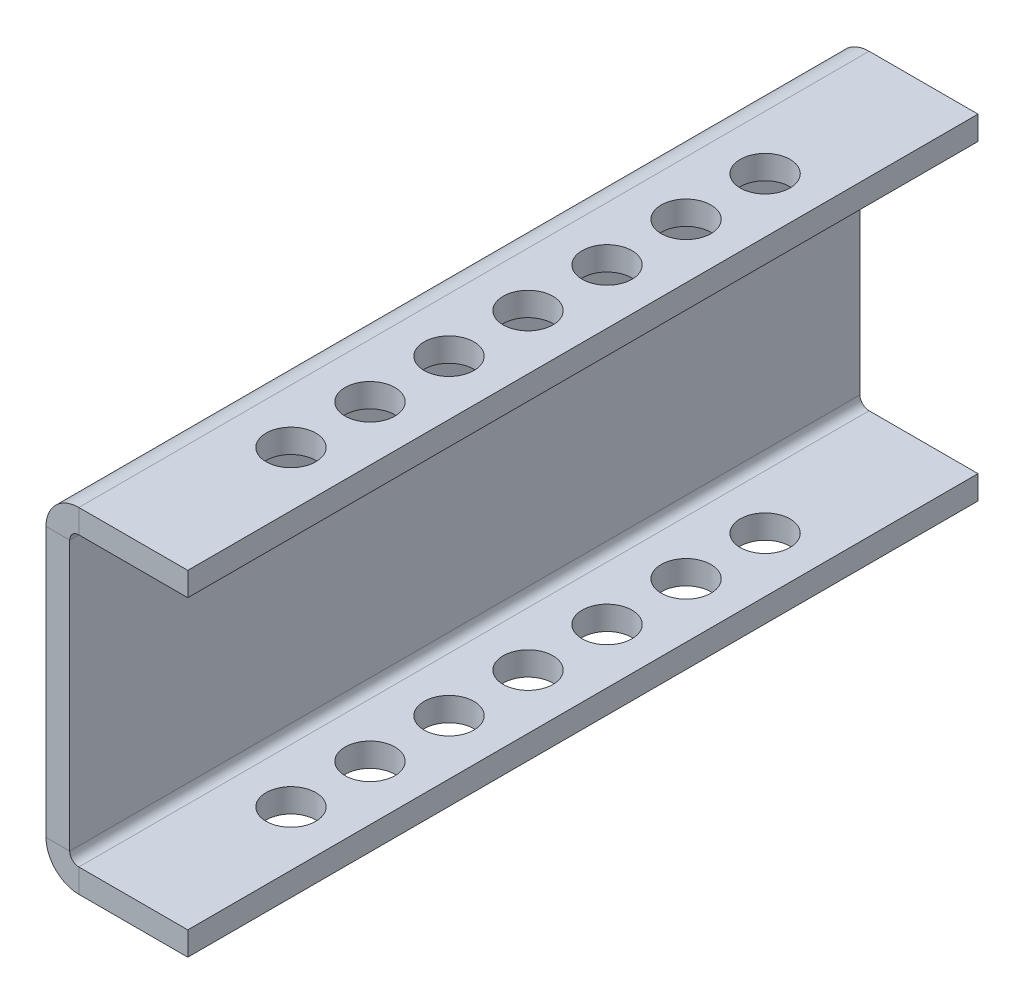
ISO-10303-21;
HEADER;
FILE_DESCRIPTION(('STEP AP214'),'2;1');
FILE_NAME('part.step','',(''),(''),'','','');
FILE_SCHEMA(('AUTOMOTIVE_DESIGN { 1 0 10303 214 1 1 1 1 }'));
ENDSEC;
DATA;
#1=APPLICATION_CONTEXT('core data for automotive mechanical design processes');
#2=APPLICATION_PROTOCOL_DEFINITION('international standard','automotive_design',2000,#1);
#3=PRODUCT_CONTEXT('',#1,'mechanical');
#4=PRODUCT('Part','Part','',(#3));
#5=PRODUCT_RELATED_PRODUCT_CATEGORY('part','',(#4));
#6=PRODUCT_DEFINITION_FORMATION('','',#4);
#7=PRODUCT_DEFINITION_CONTEXT('part definition',#1,'design');
#8=PRODUCT_DEFINITION('design','',#6,#7);
#9=PRODUCT_DEFINITION_SHAPE('','',#8);
#10=(LENGTH_UNIT() NAMED_UNIT(*) SI_UNIT(.MILLI.,.METRE.));
#11=(NAMED_UNIT(*) PLANE_ANGLE_UNIT() SI_UNIT($,.RADIAN.));
#12=(NAMED_UNIT(*) SI_UNIT($,.STERADIAN.) SOLID_ANGLE_UNIT());
#13=UNCERTAINTY_MEASURE_WITH_UNIT(LENGTH_MEASURE(1.E-05),#10,'distance_accuracy_value','');
#14=(GEOMETRIC_REPRESENTATION_CONTEXT(3) GLOBAL_UNCERTAINTY_ASSIGNED_CONTEXT((#13)) GLOBAL_UNIT_ASSIGNED_CONTEXT((#10,
#11,#12)) REPRESENTATION_CONTEXT('',''));
#15=CARTESIAN_POINT('',(0.,0.,0.));
#16=DIRECTION('',(0.,0.,1.));
#17=DIRECTION('',(1.,0.,0.));
#18=AXIS2_PLACEMENT_3D('',#15,#16,#17);
#19=CARTESIAN_POINT('',(-1.905,0.,0.));
#20=DIRECTION('',(-1.,0.,0.));
#21=DIRECTION('',(0.,0.,1.));
#22=AXIS2_PLACEMENT_3D('',#19,#20,#21);
#23=PLANE('',#22);
#24=DIRECTION('',(0.,-1.,0.));
#25=VECTOR('',#24,1.);
#26=CARTESIAN_POINT('',(-1.905,22.225,31.75));
#27=LINE('',#26,#25);
#28=CARTESIAN_POINT('',(-1.905,10.8204,31.75));
#29=VERTEX_POINT('',#28);
#30=CARTESIAN_POINT('',(-1.905,-10.8204,31.75));
#31=VERTEX_POINT('',#30);
#32=EDGE_CURVE('E248',#29,#31,#27,.T.);
#33=ORIENTED_EDGE('',*,*,#32,.F.);
#34=DIRECTION('',(0.,0.,-1.));
#35=VECTOR('',#34,1.);
#36=CARTESIAN_POINT('',(-1.905,10.8204,0.));
#37=LINE('',#36,#35);
#38=CARTESIAN_POINT('',(-1.905,10.8204,-31.75));
#39=VERTEX_POINT('',#38);
#40=EDGE_CURVE('E239',#29,#39,#37,.T.);
#41=ORIENTED_EDGE('',*,*,#40,.T.);
#42=DIRECTION('',(0.,1.,0.));
#43=VECTOR('',#42,1.);
#44=CARTESIAN_POINT('',(-1.905,22.225,-31.75));
#45=LINE('',#44,#43);
#46=CARTESIAN_POINT('',(-1.905,-10.8204,-31.75));
#47=VERTEX_POINT('',#46);
#48=EDGE_CURVE('E231',#47,#39,#45,.T.);
#49=ORIENTED_EDGE('',*,*,#48,.F.);
#50=DIRECTION('',(0.,0.,-1.));
#51=VECTOR('',#50,1.);
#52=CARTESIAN_POINT('',(-1.905,-10.8204,0.));
#53=LINE('',#52,#51);
#54=EDGE_CURVE('E227',#31,#47,#53,.T.);
#55=ORIENTED_EDGE('',*,*,#54,.F.);
#56=EDGE_LOOP('',(#33,#41,#49,#55));
#57=FACE_BOUND('',#56,.T.);
#58=ADVANCED_FACE('F47',(#57),#23,.T.);
#59=CARTESIAN_POINT('',(-1.905,22.225,-31.75));
#60=DIRECTION('',(0.,0.,-1.));
#61=DIRECTION('',(-1.,0.,0.));
#62=AXIS2_PLACEMENT_3D('',#59,#60,#61);
#63=PLANE('',#62);
#64=ORIENTED_EDGE('',*,*,#48,.T.);
#65=DIRECTION('',(1.,0.,0.));
#66=VECTOR('',#65,1.);
#67=CARTESIAN_POINT('',(-1.905,10.8204,-31.75));
#68=LINE('',#67,#66);
#69=CARTESIAN_POINT('',(0.,10.8204,-31.75));
#70=VERTEX_POINT('',#69);
#71=EDGE_CURVE('E12',#39,#70,#68,.T.);
#72=ORIENTED_EDGE('',*,*,#71,.T.);
#73=DIRECTION('',(0.,1.,0.));
#74=VECTOR('',#73,1.);
#75=CARTESIAN_POINT('',(0.,22.225,-31.75));
#76=LINE('',#75,#74);
#77=CARTESIAN_POINT('',(0.,-10.8204,-31.75));
#78=VERTEX_POINT('',#77);
#79=EDGE_CURVE('E249',#78,#70,#76,.T.);
#80=ORIENTED_EDGE('',*,*,#79,.F.);
#81=DIRECTION('',(1.,0.,0.));
#82=VECTOR('',#81,1.);
#83=CARTESIAN_POINT('',(-1.905,-10.8204,-31.75));
#84=LINE('',#83,#82);
#85=EDGE_CURVE('E230',#47,#78,#84,.T.);
#86=ORIENTED_EDGE('',*,*,#85,.F.);
#87=EDGE_LOOP('',(#64,#72,#80,#86));
#88=FACE_BOUND('',#87,.T.);
#89=ADVANCED_FACE('F49',(#88),#63,.T.);
#90=CARTESIAN_POINT('',(-1.905,22.225,31.75));
#91=DIRECTION('',(0.,0.,1.));
#92=DIRECTION('',(0.,-1.,0.));
#93=AXIS2_PLACEMENT_3D('',#90,#91,#92);
#94=PLANE('',#93);
#95=DIRECTION('',(0.,-1.,0.));
#96=VECTOR('',#95,1.);
#97=CARTESIAN_POINT('',(0.,22.225,31.75));
#98=LINE('',#97,#96);
#99=CARTESIAN_POINT('',(0.,10.8204,31.75));
#100=VERTEX_POINT('',#99);
#101=CARTESIAN_POINT('',(0.,-10.8204,31.75));
#102=VERTEX_POINT('',#101);
#103=EDGE_CURVE('E70',#100,#102,#98,.T.);
#104=ORIENTED_EDGE('',*,*,#103,.F.);
#105=DIRECTION('',(-1.,0.,0.));
#106=VECTOR('',#105,1.);
#107=CARTESIAN_POINT('',(-1.905,10.8204,31.75));
#108=LINE('',#107,#106);
#109=EDGE_CURVE('E242',#100,#29,#108,.T.);
#110=ORIENTED_EDGE('',*,*,#109,.T.);
#111=ORIENTED_EDGE('',*,*,#32,.T.);
#112=DIRECTION('',(-1.,0.,0.));
#113=VECTOR('',#112,1.);
#114=CARTESIAN_POINT('',(-1.905,-10.8204,31.75));
#115=LINE('',#114,#113);
#116=EDGE_CURVE('E236',#102,#31,#115,.T.);
#117=ORIENTED_EDGE('',*,*,#116,.F.);
#118=EDGE_LOOP('',(#104,#110,#111,#117));
#119=FACE_BOUND('',#118,.T.);
#120=ADVANCED_FACE('F312',(#119),#94,.T.);
#121=CARTESIAN_POINT('',(0.,0.,0.));
#122=DIRECTION('',(-1.,0.,0.));
#123=DIRECTION('',(0.,0.,1.));
#124=AXIS2_PLACEMENT_3D('',#121,#122,#123);
#125=PLANE('',#124);
#126=DIRECTION('',(0.,0.,-1.));
#127=VECTOR('',#126,1.);
#128=CARTESIAN_POINT('',(0.,10.8204,0.));
#129=LINE('',#128,#127);
#130=EDGE_CURVE('E56',#100,#70,#129,.T.);
#131=ORIENTED_EDGE('',*,*,#130,.F.);
#132=ORIENTED_EDGE('',*,*,#103,.T.);
#133=DIRECTION('',(0.,0.,-1.));
#134=VECTOR('',#133,1.);
#135=CARTESIAN_POINT('',(0.,-10.8204,0.));
#136=LINE('',#135,#134);
#137=EDGE_CURVE('E234',#102,#78,#136,.T.);
#138=ORIENTED_EDGE('',*,*,#137,.T.);
#139=ORIENTED_EDGE('',*,*,#79,.T.);
#140=EDGE_LOOP('',(#131,#132,#138,#139));
#141=FACE_BOUND('',#140,.T.);
#142=ADVANCED_FACE('F372',(#141),#125,.F.);
#143=CARTESIAN_POINT('',(0.7366,-10.8204,31.75));
#144=DIRECTION('',(0.,0.,1.));
#145=DIRECTION('',(1.,0.,0.));
#146=AXIS2_PLACEMENT_3D('',#143,#144,#145);
#147=PLANE('',#146);
#148=DIRECTION('',(0.,-1.,0.));
#149=VECTOR('',#148,1.);
#150=CARTESIAN_POINT('',(0.736600000000009,-13.462,31.75));
#151=LINE('',#150,#149);
#152=CARTESIAN_POINT('',(0.736600000000002,-11.557,31.75));
#153=VERTEX_POINT('',#152);
#154=CARTESIAN_POINT('',(0.736600000000005,-13.462,31.75));
#155=VERTEX_POINT('',#154);
#156=EDGE_CURVE('E192',#153,#155,#151,.T.);
#157=ORIENTED_EDGE('',*,*,#156,.F.);
#158=CARTESIAN_POINT('',(0.7366,-10.8204,31.75));
#159=DIRECTION('',(0.,0.,1.));
#160=DIRECTION('',(0.,-1.,0.));
#161=AXIS2_PLACEMENT_3D('',#158,#159,#160);
#162=CIRCLE('',#161,0.7366);
#163=EDGE_CURVE('E189',#153,#102,#162,.F.);
#164=ORIENTED_EDGE('',*,*,#163,.T.);
#165=ORIENTED_EDGE('',*,*,#116,.T.);
#166=CARTESIAN_POINT('',(0.7366,-10.8204,31.75));
#167=DIRECTION('',(0.,0.,-1.));
#168=DIRECTION('',(1.,0.,0.));
#169=AXIS2_PLACEMENT_3D('',#166,#167,#168);
#170=CIRCLE('',#169,2.6416);
#171=EDGE_CURVE('E216',#155,#31,#170,.T.);
#172=ORIENTED_EDGE('',*,*,#171,.F.);
#173=EDGE_LOOP('',(#157,#164,#165,#172));
#174=FACE_BOUND('',#173,.T.);
#175=ADVANCED_FACE('F342',(#174),#147,.T.);
#176=CARTESIAN_POINT('',(0.7366,-10.8204,-31.75));
#177=DIRECTION('',(0.,0.,-1.));
#178=DIRECTION('',(-1.,0.,0.));
#179=AXIS2_PLACEMENT_3D('',#176,#177,#178);
#180=PLANE('',#179);
#181=CARTESIAN_POINT('',(0.7366,-10.8204,-31.75));
#182=DIRECTION('',(0.,0.,1.));
#183=DIRECTION('',(0.,-1.,0.));
#184=AXIS2_PLACEMENT_3D('',#181,#182,#183);
#185=CIRCLE('',#184,0.7366);
#186=CARTESIAN_POINT('',(0.736600000000009,-11.557,-31.75));
#187=VERTEX_POINT('',#186);
#188=EDGE_CURVE('E220',#78,#187,#185,.T.);
#189=ORIENTED_EDGE('',*,*,#188,.T.);
#190=DIRECTION('',(0.,1.,0.));
#191=VECTOR('',#190,1.);
#192=CARTESIAN_POINT('',(0.736600000000016,-13.462,-31.75));
#193=LINE('',#192,#191);
#194=CARTESIAN_POINT('',(0.736600000000016,-13.462,-31.75));
#195=VERTEX_POINT('',#194);
#196=EDGE_CURVE('E201',#195,#187,#193,.T.);
#197=ORIENTED_EDGE('',*,*,#196,.F.);
#198=CARTESIAN_POINT('',(0.7366,-10.8204,-31.75));
#199=DIRECTION('',(0.,0.,1.));
#200=DIRECTION('',(-1.,0.,0.));
#201=AXIS2_PLACEMENT_3D('',#198,#199,#200);
#202=CIRCLE('',#201,2.6416);
#203=EDGE_CURVE('E219',#47,#195,#202,.T.);
#204=ORIENTED_EDGE('',*,*,#203,.F.);
#205=ORIENTED_EDGE('',*,*,#85,.T.);
#206=EDGE_LOOP('',(#189,#197,#204,#205));
#207=FACE_BOUND('',#206,.T.);
#208=ADVANCED_FACE('F328',(#207),#180,.T.);
#209=CARTESIAN_POINT('',(0.7366,-10.8204,-63.5839497471409));
#210=DIRECTION('',(0.,0.,1.));
#211=DIRECTION('',(0.,-1.,0.));
#212=AXIS2_PLACEMENT_3D('',#209,#210,#211);
#213=CYLINDRICAL_SURFACE('',#212,2.6416);
#214=ORIENTED_EDGE('',*,*,#54,.T.);
#215=ORIENTED_EDGE('',*,*,#203,.T.);
#216=DIRECTION('',(0.,0.,-1.));
#217=VECTOR('',#216,1.);
#218=CARTESIAN_POINT('',(0.736600000000013,-13.462,0.));
#219=LINE('',#218,#217);
#220=EDGE_CURVE('E207',#155,#195,#219,.T.);
#221=ORIENTED_EDGE('',*,*,#220,.F.);
#222=ORIENTED_EDGE('',*,*,#171,.T.);
#223=EDGE_LOOP('',(#214,#215,#221,#222));
#224=FACE_BOUND('',#223,.T.);
#225=ADVANCED_FACE('F324',(#224),#213,.T.);
#226=CARTESIAN_POINT('',(0.7366,-10.8204,-63.5839497471409));
#227=DIRECTION('',(0.,0.,1.));
#228=DIRECTION('',(0.,-1.,0.));
#229=AXIS2_PLACEMENT_3D('',#226,#227,#228);
#230=CYLINDRICAL_SURFACE('',#229,0.7366);
#231=ORIENTED_EDGE('',*,*,#137,.F.);
#232=ORIENTED_EDGE('',*,*,#163,.F.);
#233=DIRECTION('',(0.,0.,-1.));
#234=VECTOR('',#233,1.);
#235=CARTESIAN_POINT('',(0.736600000000006,-11.557,0.));
#236=LINE('',#235,#234);
#237=EDGE_CURVE('E182',#153,#187,#236,.T.);
#238=ORIENTED_EDGE('',*,*,#237,.T.);
#239=ORIENTED_EDGE('',*,*,#188,.F.);
#240=EDGE_LOOP('',(#231,#232,#238,#239));
#241=FACE_BOUND('',#240,.T.);
#242=ADVANCED_FACE('F337',(#241),#230,.F.);
#243=CARTESIAN_POINT('',(9.48796792441074,-13.462,-31.75));
#244=DIRECTION('',(1.,0.,0.));
#245=DIRECTION('',(0.,0.,-1.));
#246=AXIS2_PLACEMENT_3D('',#243,#244,#245);
#247=PLANE('',#246);
#248=DIRECTION('',(0.,0.,-1.));
#249=VECTOR('',#248,1.);
#250=CARTESIAN_POINT('',(9.48796792441073,-11.557,-31.75));
#251=LINE('',#250,#249);
#252=CARTESIAN_POINT('',(9.48796792441073,-11.557,31.75));
#253=VERTEX_POINT('',#252);
#254=CARTESIAN_POINT('',(9.48796792441073,-11.557,-31.75));
#255=VERTEX_POINT('',#254);
#256=EDGE_CURVE('E196',#253,#255,#251,.T.);
#257=ORIENTED_EDGE('',*,*,#256,.F.);
#258=DIRECTION('',(0.,1.,0.));
#259=VECTOR('',#258,1.);
#260=CARTESIAN_POINT('',(9.48796792441074,-13.462,31.75));
#261=LINE('',#260,#259);
#262=CARTESIAN_POINT('',(9.48796792441074,-13.462,31.75));
#263=VERTEX_POINT('',#262);
#264=EDGE_CURVE('E186',#263,#253,#261,.T.);
#265=ORIENTED_EDGE('',*,*,#264,.F.);
#266=DIRECTION('',(0.,0.,-1.));
#267=VECTOR('',#266,1.);
#268=CARTESIAN_POINT('',(9.48796792441074,-13.462,-31.75));
#269=LINE('',#268,#267);
#270=CARTESIAN_POINT('',(9.48796792441074,-13.462,-31.75));
#271=VERTEX_POINT('',#270);
#272=EDGE_CURVE('E211',#263,#271,#269,.T.);
#273=ORIENTED_EDGE('',*,*,#272,.T.);
#274=DIRECTION('',(0.,1.,0.));
#275=VECTOR('',#274,1.);
#276=CARTESIAN_POINT('',(9.48796792441074,-13.462,-31.75));
#277=LINE('',#276,#275);
#278=EDGE_CURVE('E209',#271,#255,#277,.T.);
#279=ORIENTED_EDGE('',*,*,#278,.T.);
#280=EDGE_LOOP('',(#257,#265,#273,#279));
#281=FACE_BOUND('',#280,.T.);
#282=ADVANCED_FACE('F352',(#281),#247,.T.);
#283=CARTESIAN_POINT('',(-12.7370320755893,-13.462,0.));
#284=DIRECTION('',(0.,-1.,0.));
#285=DIRECTION('',(0.,0.,1.));
#286=AXIS2_PLACEMENT_3D('',#283,#284,#285);
#287=PLANE('',#286);
#288=CARTESIAN_POINT('',(5.07999999999992,-13.462,19.05));
#289=DIRECTION('',(0.,-1.,0.));
#290=DIRECTION('',(1.,0.,0.));
#291=AXIS2_PLACEMENT_3D('',#288,#289,#290);
#292=CIRCLE('',#291,2.);
#293=CARTESIAN_POINT('',(7.07999999999992,-13.462,19.05));
#294=VERTEX_POINT('',#293);
#295=EDGE_CURVE('E740',#294,#294,#292,.F.);
#296=ORIENTED_EDGE('',*,*,#295,.T.);
#297=EDGE_LOOP('',(#296));
#298=FACE_BOUND('',#297,.T.);
#299=CARTESIAN_POINT('',(5.07999999999992,-13.462,12.7));
#300=DIRECTION('',(0.,-1.,0.));
#301=DIRECTION('',(1.,0.,0.));
#302=AXIS2_PLACEMENT_3D('',#299,#300,#301);
#303=CIRCLE('',#302,2.);
#304=CARTESIAN_POINT('',(7.07999999999992,-13.462,12.7));
#305=VERTEX_POINT('',#304);
#306=EDGE_CURVE('E771',#305,#305,#303,.F.);
#307=ORIENTED_EDGE('',*,*,#306,.T.);
#308=EDGE_LOOP('',(#307));
#309=FACE_BOUND('',#308,.T.);
#310=CARTESIAN_POINT('',(5.07999999999992,-13.462,-6.35));
#311=DIRECTION('',(0.,-1.,0.));
#312=DIRECTION('',(1.,0.,0.));
#313=AXIS2_PLACEMENT_3D('',#310,#311,#312);
#314=CIRCLE('',#313,2.);
#315=CARTESIAN_POINT('',(7.07999999999992,-13.462,-6.35));
#316=VERTEX_POINT('',#315);
#317=EDGE_CURVE('E765',#316,#316,#314,.F.);
#318=ORIENTED_EDGE('',*,*,#317,.T.);
#319=EDGE_LOOP('',(#318));
#320=FACE_BOUND('',#319,.T.);
#321=CARTESIAN_POINT('',(5.07999999999992,-13.462,-19.05));
#322=DIRECTION('',(0.,-1.,0.));
#323=DIRECTION('',(1.,0.,0.));
#324=AXIS2_PLACEMENT_3D('',#321,#322,#323);
#325=CIRCLE('',#324,2.);
#326=CARTESIAN_POINT('',(7.07999999999992,-13.462,-19.05));
#327=VERTEX_POINT('',#326);
#328=EDGE_CURVE('E777',#327,#327,#325,.F.);
#329=ORIENTED_EDGE('',*,*,#328,.T.);
#330=EDGE_LOOP('',(#329));
#331=FACE_BOUND('',#330,.T.);
#332=CARTESIAN_POINT('',(5.07999999999992,-13.462,-12.7));
#333=DIRECTION('',(0.,-1.,0.));
#334=DIRECTION('',(1.,0.,0.));
#335=AXIS2_PLACEMENT_3D('',#332,#333,#334);
#336=CIRCLE('',#335,2.);
#337=CARTESIAN_POINT('',(7.07999999999992,-13.462,-12.7));
#338=VERTEX_POINT('',#337);
#339=EDGE_CURVE('E784',#338,#338,#336,.F.);
#340=ORIENTED_EDGE('',*,*,#339,.T.);
#341=EDGE_LOOP('',(#340));
#342=FACE_BOUND('',#341,.T.);
#343=CARTESIAN_POINT('',(5.07999999999992,-13.462,6.35));
#344=DIRECTION('',(0.,-1.,0.));
#345=DIRECTION('',(1.,0.,0.));
#346=AXIS2_PLACEMENT_3D('',#343,#344,#345);
#347=CIRCLE('',#346,2.);
#348=CARTESIAN_POINT('',(7.07999999999991,-13.462,6.35));
#349=VERTEX_POINT('',#348);
#350=EDGE_CURVE('E789',#349,#349,#347,.F.);
#351=ORIENTED_EDGE('',*,*,#350,.T.);
#352=EDGE_LOOP('',(#351));
#353=FACE_BOUND('',#352,.T.);
#354=CARTESIAN_POINT('',(5.07999999999992,-13.462,0.));
#355=DIRECTION('',(0.,-1.,0.));
#356=DIRECTION('',(1.,0.,0.));
#357=AXIS2_PLACEMENT_3D('',#354,#355,#356);
#358=CIRCLE('',#357,2.);
#359=CARTESIAN_POINT('',(7.07999999999992,-13.462,0.));
#360=VERTEX_POINT('',#359);
#361=EDGE_CURVE('E259',#360,#360,#358,.F.);
#362=ORIENTED_EDGE('',*,*,#361,.T.);
#363=EDGE_LOOP('',(#362));
#364=FACE_BOUND('',#363,.T.);
#365=DIRECTION('',(1.,0.,0.));
#366=VECTOR('',#365,1.);
#367=CARTESIAN_POINT('',(-34.9620320755893,-13.4620000000001,31.75));
#368=LINE('',#367,#366);
#369=EDGE_CURVE('E190',#155,#263,#368,.T.);
#370=ORIENTED_EDGE('',*,*,#369,.F.);
#371=ORIENTED_EDGE('',*,*,#220,.T.);
#372=DIRECTION('',(-1.,0.,0.));
#373=VECTOR('',#372,1.);
#374=CARTESIAN_POINT('',(-34.9620320755893,-13.4620000000001,-31.75));
#375=LINE('',#374,#373);
#376=EDGE_CURVE('E204',#271,#195,#375,.T.);
#377=ORIENTED_EDGE('',*,*,#376,.F.);
#378=ORIENTED_EDGE('',*,*,#272,.F.);
#379=EDGE_LOOP('',(#370,#371,#377,#378));
#380=FACE_BOUND('',#379,.T.);
#381=ADVANCED_FACE('F349',(#298,#309,#320,#331,#342,#353,#364,#380),#287,.T.);
#382=CARTESIAN_POINT('',(-34.9620320755893,-13.4620000000001,-31.75));
#383=DIRECTION('',(0.,0.,-1.));
#384=DIRECTION('',(0.,-1.,0.));
#385=AXIS2_PLACEMENT_3D('',#382,#383,#384);
#386=PLANE('',#385);
#387=ORIENTED_EDGE('',*,*,#376,.T.);
#388=ORIENTED_EDGE('',*,*,#196,.T.);
#389=DIRECTION('',(-1.,0.,0.));
#390=VECTOR('',#389,1.);
#391=CARTESIAN_POINT('',(-34.9620320755893,-11.5570000000001,-31.75));
#392=LINE('',#391,#390);
#393=EDGE_CURVE('E194',#255,#187,#392,.T.);
#394=ORIENTED_EDGE('',*,*,#393,.F.);
#395=ORIENTED_EDGE('',*,*,#278,.F.);
#396=EDGE_LOOP('',(#387,#388,#394,#395));
#397=FACE_BOUND('',#396,.T.);
#398=ADVANCED_FACE('F331',(#397),#386,.T.);
#399=CARTESIAN_POINT('',(-12.7370320755893,-11.557,0.));
#400=DIRECTION('',(0.,-1.,0.));
#401=DIRECTION('',(0.,0.,1.));
#402=AXIS2_PLACEMENT_3D('',#399,#400,#401);
#403=PLANE('',#402);
#404=CARTESIAN_POINT('',(5.07999999999992,-11.557,19.05));
#405=DIRECTION('',(0.,-1.,0.));
#406=DIRECTION('',(1.,0.,0.));
#407=AXIS2_PLACEMENT_3D('',#404,#405,#406);
#408=CIRCLE('',#407,2.);
#409=CARTESIAN_POINT('',(7.07999999999992,-11.557,19.05));
#410=VERTEX_POINT('',#409);
#411=EDGE_CURVE('E174',#410,#410,#408,.T.);
#412=ORIENTED_EDGE('',*,*,#411,.T.);
#413=EDGE_LOOP('',(#412));
#414=FACE_BOUND('',#413,.T.);
#415=CARTESIAN_POINT('',(5.07999999999992,-11.557,12.7));
#416=DIRECTION('',(0.,-1.,0.));
#417=DIRECTION('',(1.,0.,0.));
#418=AXIS2_PLACEMENT_3D('',#415,#416,#417);
#419=CIRCLE('',#418,2.);
#420=CARTESIAN_POINT('',(7.07999999999992,-11.557,12.7));
#421=VERTEX_POINT('',#420);
#422=EDGE_CURVE('E277',#421,#421,#419,.T.);
#423=ORIENTED_EDGE('',*,*,#422,.T.);
#424=EDGE_LOOP('',(#423));
#425=FACE_BOUND('',#424,.T.);
#426=CARTESIAN_POINT('',(5.07999999999992,-11.557,-6.35));
#427=DIRECTION('',(0.,-1.,0.));
#428=DIRECTION('',(1.,0.,0.));
#429=AXIS2_PLACEMENT_3D('',#426,#427,#428);
#430=CIRCLE('',#429,2.);
#431=CARTESIAN_POINT('',(7.07999999999992,-11.557,-6.35));
#432=VERTEX_POINT('',#431);
#433=EDGE_CURVE('E274',#432,#432,#430,.T.);
#434=ORIENTED_EDGE('',*,*,#433,.T.);
#435=EDGE_LOOP('',(#434));
#436=FACE_BOUND('',#435,.T.);
#437=CARTESIAN_POINT('',(5.07999999999992,-11.557,-19.05));
#438=DIRECTION('',(0.,-1.,0.));
#439=DIRECTION('',(1.,0.,0.));
#440=AXIS2_PLACEMENT_3D('',#437,#438,#439);
#441=CIRCLE('',#440,2.);
#442=CARTESIAN_POINT('',(7.07999999999992,-11.557,-19.05));
#443=VERTEX_POINT('',#442);
#444=EDGE_CURVE('E271',#443,#443,#441,.T.);
#445=ORIENTED_EDGE('',*,*,#444,.T.);
#446=EDGE_LOOP('',(#445));
#447=FACE_BOUND('',#446,.T.);
#448=CARTESIAN_POINT('',(5.07999999999992,-11.557,-12.7));
#449=DIRECTION('',(0.,-1.,0.));
#450=DIRECTION('',(1.,0.,0.));
#451=AXIS2_PLACEMENT_3D('',#448,#449,#450);
#452=CIRCLE('',#451,2.);
#453=CARTESIAN_POINT('',(7.07999999999992,-11.557,-12.7));
#454=VERTEX_POINT('',#453);
#455=EDGE_CURVE('E267',#454,#454,#452,.T.);
#456=ORIENTED_EDGE('',*,*,#455,.T.);
#457=EDGE_LOOP('',(#456));
#458=FACE_BOUND('',#457,.T.);
#459=CARTESIAN_POINT('',(5.07999999999992,-11.557,6.35));
#460=DIRECTION('',(0.,-1.,0.));
#461=DIRECTION('',(1.,0.,0.));
#462=AXIS2_PLACEMENT_3D('',#459,#460,#461);
#463=CIRCLE('',#462,2.);
#464=CARTESIAN_POINT('',(7.07999999999992,-11.557,6.35));
#465=VERTEX_POINT('',#464);
#466=EDGE_CURVE('E263',#465,#465,#463,.T.);
#467=ORIENTED_EDGE('',*,*,#466,.T.);
#468=EDGE_LOOP('',(#467));
#469=FACE_BOUND('',#468,.T.);
#470=CARTESIAN_POINT('',(5.07999999999992,-11.557,0.));
#471=DIRECTION('',(0.,-1.,0.));
#472=DIRECTION('',(1.,0.,0.));
#473=AXIS2_PLACEMENT_3D('',#470,#471,#472);
#474=CIRCLE('',#473,2.);
#475=CARTESIAN_POINT('',(7.07999999999992,-11.557,0.));
#476=VERTEX_POINT('',#475);
#477=EDGE_CURVE('E258',#476,#476,#474,.T.);
#478=ORIENTED_EDGE('',*,*,#477,.T.);
#479=EDGE_LOOP('',(#478));
#480=FACE_BOUND('',#479,.T.);
#481=ORIENTED_EDGE('',*,*,#237,.F.);
#482=DIRECTION('',(1.,0.,0.));
#483=VECTOR('',#482,1.);
#484=CARTESIAN_POINT('',(-34.9620320755893,-11.5570000000001,31.75));
#485=LINE('',#484,#483);
#486=EDGE_CURVE('E199',#153,#253,#485,.T.);
#487=ORIENTED_EDGE('',*,*,#486,.T.);
#488=ORIENTED_EDGE('',*,*,#256,.T.);
#489=ORIENTED_EDGE('',*,*,#393,.T.);
#490=EDGE_LOOP('',(#481,#487,#488,#489));
#491=FACE_BOUND('',#490,.T.);
#492=ADVANCED_FACE('F340',(#414,#425,#436,#447,#458,#469,#480,#491),#403,.F.);
#493=CARTESIAN_POINT('',(-34.9620320755893,-13.4620000000001,31.75));
#494=DIRECTION('',(0.,0.,1.));
#495=DIRECTION('',(1.,0.,0.));
#496=AXIS2_PLACEMENT_3D('',#493,#494,#495);
#497=PLANE('',#496);
#498=ORIENTED_EDGE('',*,*,#486,.F.);
#499=ORIENTED_EDGE('',*,*,#156,.T.);
#500=ORIENTED_EDGE('',*,*,#369,.T.);
#501=ORIENTED_EDGE('',*,*,#264,.T.);
#502=EDGE_LOOP('',(#498,#499,#500,#501));
#503=FACE_BOUND('',#502,.T.);
#504=ADVANCED_FACE('F345',(#503),#497,.T.);
#505=CARTESIAN_POINT('',(0.7366,10.8204,31.75));
#506=DIRECTION('',(0.,0.,1.));
#507=DIRECTION('',(1.,0.,0.));
#508=AXIS2_PLACEMENT_3D('',#505,#506,#507);
#509=PLANE('',#508);
#510=ORIENTED_EDGE('',*,*,#109,.F.);
#511=CARTESIAN_POINT('',(0.7366,10.8204,31.75));
#512=DIRECTION('',(0.,0.,-1.));
#513=DIRECTION('',(0.,1.,0.));
#514=AXIS2_PLACEMENT_3D('',#511,#512,#513);
#515=CIRCLE('',#514,0.7366);
#516=CARTESIAN_POINT('',(0.736600000000002,11.557,31.75));
#517=VERTEX_POINT('',#516);
#518=EDGE_CURVE('E157',#100,#517,#515,.T.);
#519=ORIENTED_EDGE('',*,*,#518,.T.);
#520=DIRECTION('',(0.,1.,0.));
#521=VECTOR('',#520,1.);
#522=CARTESIAN_POINT('',(0.736600000000009,13.462,31.75));
#523=LINE('',#522,#521);
#524=CARTESIAN_POINT('',(0.736600000000011,13.462,31.75));
#525=VERTEX_POINT('',#524);
#526=EDGE_CURVE('E164',#517,#525,#523,.T.);
#527=ORIENTED_EDGE('',*,*,#526,.T.);
#528=CARTESIAN_POINT('',(0.7366,10.8204,31.75));
#529=DIRECTION('',(0.,0.,-1.));
#530=DIRECTION('',(1.,0.,0.));
#531=AXIS2_PLACEMENT_3D('',#528,#529,#530);
#532=CIRCLE('',#531,2.6416);
#533=EDGE_CURVE('E175',#29,#525,#532,.T.);
#534=ORIENTED_EDGE('',*,*,#533,.F.);
#535=EDGE_LOOP('',(#510,#519,#527,#534));
#536=FACE_BOUND('',#535,.T.);
#537=ADVANCED_FACE('F304',(#536),#509,.T.);
#538=CARTESIAN_POINT('',(0.7366,10.8204,-31.75));
#539=DIRECTION('',(0.,0.,-1.));
#540=DIRECTION('',(-1.,0.,0.));
#541=AXIS2_PLACEMENT_3D('',#538,#539,#540);
#542=PLANE('',#541);
#543=DIRECTION('',(0.,-1.,0.));
#544=VECTOR('',#543,1.);
#545=CARTESIAN_POINT('',(0.736600000000009,13.462,-31.75));
#546=LINE('',#545,#544);
#547=CARTESIAN_POINT('',(0.736600000000011,13.462,-31.75));
#548=VERTEX_POINT('',#547);
#549=CARTESIAN_POINT('',(0.736600000000002,11.557,-31.75));
#550=VERTEX_POINT('',#549);
#551=EDGE_CURVE('E146',#548,#550,#546,.T.);
#552=ORIENTED_EDGE('',*,*,#551,.T.);
#553=CARTESIAN_POINT('',(0.7366,10.8204,-31.75));
#554=DIRECTION('',(0.,0.,-1.));
#555=DIRECTION('',(0.,1.,0.));
#556=AXIS2_PLACEMENT_3D('',#553,#554,#555);
#557=CIRCLE('',#556,0.7366);
#558=EDGE_CURVE('E179',#550,#70,#557,.F.);
#559=ORIENTED_EDGE('',*,*,#558,.T.);
#560=ORIENTED_EDGE('',*,*,#71,.F.);
#561=CARTESIAN_POINT('',(0.7366,10.8204,-31.75));
#562=DIRECTION('',(0.,0.,1.));
#563=DIRECTION('',(-1.,0.,0.));
#564=AXIS2_PLACEMENT_3D('',#561,#562,#563);
#565=CIRCLE('',#564,2.6416);
#566=EDGE_CURVE('E178',#548,#39,#565,.T.);
#567=ORIENTED_EDGE('',*,*,#566,.F.);
#568=EDGE_LOOP('',(#552,#559,#560,#567));
#569=FACE_BOUND('',#568,.T.);
#570=ADVANCED_FACE('F317',(#569),#542,.T.);
#571=CARTESIAN_POINT('',(0.7366,10.8204,63.5839497471409));
#572=DIRECTION('',(0.,0.,-1.));
#573=DIRECTION('',(0.,1.,0.));
#574=AXIS2_PLACEMENT_3D('',#571,#572,#573);
#575=CYLINDRICAL_SURFACE('',#574,2.6416);
#576=ORIENTED_EDGE('',*,*,#566,.T.);
#577=ORIENTED_EDGE('',*,*,#40,.F.);
#578=ORIENTED_EDGE('',*,*,#533,.T.);
#579=DIRECTION('',(0.,0.,-1.));
#580=VECTOR('',#579,1.);
#581=CARTESIAN_POINT('',(0.736600000000009,13.462,0.));
#582=LINE('',#581,#580);
#583=EDGE_CURVE('E172',#525,#548,#582,.T.);
#584=ORIENTED_EDGE('',*,*,#583,.T.);
#585=EDGE_LOOP('',(#576,#577,#578,#584));
#586=FACE_BOUND('',#585,.T.);
#587=ADVANCED_FACE('F307',(#586),#575,.T.);
#588=CARTESIAN_POINT('',(0.7366,10.8204,63.5839497471409));
#589=DIRECTION('',(0.,0.,-1.));
#590=DIRECTION('',(0.,1.,0.));
#591=AXIS2_PLACEMENT_3D('',#588,#589,#590);
#592=CYLINDRICAL_SURFACE('',#591,0.7366);
#593=ORIENTED_EDGE('',*,*,#558,.F.);
#594=DIRECTION('',(0.,0.,-1.));
#595=VECTOR('',#594,1.);
#596=CARTESIAN_POINT('',(0.736600000000002,11.557,0.));
#597=LINE('',#596,#595);
#598=EDGE_CURVE('E294',#517,#550,#597,.T.);
#599=ORIENTED_EDGE('',*,*,#598,.F.);
#600=ORIENTED_EDGE('',*,*,#518,.F.);
#601=ORIENTED_EDGE('',*,*,#130,.T.);
#602=EDGE_LOOP('',(#593,#599,#600,#601));
#603=FACE_BOUND('',#602,.T.);
#604=ADVANCED_FACE('F313',(#603),#592,.F.);
#605=CARTESIAN_POINT('',(9.48796792441075,13.462,-31.75));
#606=DIRECTION('',(1.,0.,0.));
#607=DIRECTION('',(0.,0.,1.));
#608=AXIS2_PLACEMENT_3D('',#605,#606,#607);
#609=PLANE('',#608);
#610=DIRECTION('',(0.,0.,1.));
#611=VECTOR('',#610,1.);
#612=CARTESIAN_POINT('',(9.48796792441074,11.557,-31.75));
#613=LINE('',#612,#611);
#614=CARTESIAN_POINT('',(9.48796792441074,11.557,-31.75));
#615=VERTEX_POINT('',#614);
#616=CARTESIAN_POINT('',(9.48796792441073,11.557,31.75));
#617=VERTEX_POINT('',#616);
#618=EDGE_CURVE('E150',#615,#617,#613,.T.);
#619=ORIENTED_EDGE('',*,*,#618,.F.);
#620=DIRECTION('',(0.,-1.,0.));
#621=VECTOR('',#620,1.);
#622=CARTESIAN_POINT('',(9.48796792441075,13.462,-31.75));
#623=LINE('',#622,#621);
#624=CARTESIAN_POINT('',(9.48796792441075,13.462,-31.75));
#625=VERTEX_POINT('',#624);
#626=EDGE_CURVE('E143',#625,#615,#623,.T.);
#627=ORIENTED_EDGE('',*,*,#626,.F.);
#628=DIRECTION('',(0.,0.,1.));
#629=VECTOR('',#628,1.);
#630=CARTESIAN_POINT('',(9.48796792441075,13.462,-31.75));
#631=LINE('',#630,#629);
#632=CARTESIAN_POINT('',(9.48796792441074,13.462,31.75));
#633=VERTEX_POINT('',#632);
#634=EDGE_CURVE('E155',#625,#633,#631,.T.);
#635=ORIENTED_EDGE('',*,*,#634,.T.);
#636=DIRECTION('',(0.,-1.,0.));
#637=VECTOR('',#636,1.);
#638=CARTESIAN_POINT('',(9.48796792441074,13.462,31.75));
#639=LINE('',#638,#637);
#640=EDGE_CURVE('E163',#633,#617,#639,.T.);
#641=ORIENTED_EDGE('',*,*,#640,.T.);
#642=EDGE_LOOP('',(#619,#627,#635,#641));
#643=FACE_BOUND('',#642,.T.);
#644=ADVANCED_FACE('F154',(#643),#609,.T.);
#645=CARTESIAN_POINT('',(-12.7370320755893,13.462,0.));
#646=DIRECTION('',(0.,1.,0.));
#647=DIRECTION('',(0.,0.,1.));
#648=AXIS2_PLACEMENT_3D('',#645,#646,#647);
#649=PLANE('',#648);
#650=CARTESIAN_POINT('',(5.08000000000001,13.462,19.05));
#651=DIRECTION('',(0.,1.,0.));
#652=DIRECTION('',(-1.,0.,0.));
#653=AXIS2_PLACEMENT_3D('',#650,#651,#652);
#654=CIRCLE('',#653,2.);
#655=CARTESIAN_POINT('',(3.08000000000001,13.462,19.05));
#656=VERTEX_POINT('',#655);
#657=EDGE_CURVE('E768',#656,#656,#654,.T.);
#658=ORIENTED_EDGE('',*,*,#657,.F.);
#659=EDGE_LOOP('',(#658));
#660=FACE_BOUND('',#659,.T.);
#661=CARTESIAN_POINT('',(5.08000000000001,13.462,12.7));
#662=DIRECTION('',(0.,1.,0.));
#663=DIRECTION('',(-1.,0.,0.));
#664=AXIS2_PLACEMENT_3D('',#661,#662,#663);
#665=CIRCLE('',#664,2.);
#666=CARTESIAN_POINT('',(3.08000000000001,13.462,12.7));
#667=VERTEX_POINT('',#666);
#668=EDGE_CURVE('E767',#667,#667,#665,.T.);
#669=ORIENTED_EDGE('',*,*,#668,.F.);
#670=EDGE_LOOP('',(#669));
#671=FACE_BOUND('',#670,.T.);
#672=CARTESIAN_POINT('',(5.08000000000001,13.462,-6.35));
#673=DIRECTION('',(0.,1.,0.));
#674=DIRECTION('',(-1.,0.,0.));
#675=AXIS2_PLACEMENT_3D('',#672,#673,#674);
#676=CIRCLE('',#675,2.);
#677=CARTESIAN_POINT('',(3.08000000000001,13.462,-6.35));
#678=VERTEX_POINT('',#677);
#679=EDGE_CURVE('E780',#678,#678,#676,.T.);
#680=ORIENTED_EDGE('',*,*,#679,.F.);
#681=EDGE_LOOP('',(#680));
#682=FACE_BOUND('',#681,.T.);
#683=CARTESIAN_POINT('',(5.08000000000001,13.462,-19.05));
#684=DIRECTION('',(0.,1.,0.));
#685=DIRECTION('',(-1.,0.,0.));
#686=AXIS2_PLACEMENT_3D('',#683,#684,#685);
#687=CIRCLE('',#686,2.);
#688=CARTESIAN_POINT('',(3.08000000000001,13.462,-19.05));
#689=VERTEX_POINT('',#688);
#690=EDGE_CURVE('E781',#689,#689,#687,.T.);
#691=ORIENTED_EDGE('',*,*,#690,.F.);
#692=EDGE_LOOP('',(#691));
#693=FACE_BOUND('',#692,.T.);
#694=CARTESIAN_POINT('',(5.08000000000001,13.462,-12.7));
#695=DIRECTION('',(0.,1.,0.));
#696=DIRECTION('',(-1.,0.,0.));
#697=AXIS2_PLACEMENT_3D('',#694,#695,#696);
#698=CIRCLE('',#697,2.);
#699=CARTESIAN_POINT('',(3.08000000000001,13.462,-12.7));
#700=VERTEX_POINT('',#699);
#701=EDGE_CURVE('E792',#700,#700,#698,.T.);
#702=ORIENTED_EDGE('',*,*,#701,.F.);
#703=EDGE_LOOP('',(#702));
#704=FACE_BOUND('',#703,.T.);
#705=CARTESIAN_POINT('',(5.08000000000001,13.462,6.35));
#706=DIRECTION('',(0.,1.,0.));
#707=DIRECTION('',(-1.,0.,0.));
#708=AXIS2_PLACEMENT_3D('',#705,#706,#707);
#709=CIRCLE('',#708,2.);
#710=CARTESIAN_POINT('',(3.08000000000001,13.462,6.35));
#711=VERTEX_POINT('',#710);
#712=EDGE_CURVE('E774',#711,#711,#709,.T.);
#713=ORIENTED_EDGE('',*,*,#712,.F.);
#714=EDGE_LOOP('',(#713));
#715=FACE_BOUND('',#714,.T.);
#716=CARTESIAN_POINT('',(5.08000000000001,13.462,0.));
#717=DIRECTION('',(0.,1.,0.));
#718=DIRECTION('',(-1.,0.,0.));
#719=AXIS2_PLACEMENT_3D('',#716,#717,#718);
#720=CIRCLE('',#719,2.);
#721=CARTESIAN_POINT('',(3.08000000000001,13.462,0.));
#722=VERTEX_POINT('',#721);
#723=EDGE_CURVE('E762',#722,#722,#720,.T.);
#724=ORIENTED_EDGE('',*,*,#723,.F.);
#725=EDGE_LOOP('',(#724));
#726=FACE_BOUND('',#725,.T.);
#727=ORIENTED_EDGE('',*,*,#583,.F.);
#728=DIRECTION('',(-1.,0.,0.));
#729=VECTOR('',#728,1.);
#730=CARTESIAN_POINT('',(9.48796792441074,13.462,31.75));
#731=LINE('',#730,#729);
#732=EDGE_CURVE('E162',#633,#525,#731,.T.);
#733=ORIENTED_EDGE('',*,*,#732,.F.);
#734=ORIENTED_EDGE('',*,*,#634,.F.);
#735=DIRECTION('',(1.,0.,0.));
#736=VECTOR('',#735,1.);
#737=CARTESIAN_POINT('',(9.48796792441075,13.462,-31.75));
#738=LINE('',#737,#736);
#739=EDGE_CURVE('E140',#548,#625,#738,.T.);
#740=ORIENTED_EDGE('',*,*,#739,.F.);
#741=EDGE_LOOP('',(#727,#733,#734,#740));
#742=FACE_BOUND('',#741,.T.);
#743=ADVANCED_FACE('F160',(#660,#671,#682,#693,#704,#715,#726,#742),#649,.T.);
#744=CARTESIAN_POINT('',(9.48796792441074,13.462,31.75));
#745=DIRECTION('',(0.,0.,1.));
#746=DIRECTION('',(-1.,0.,0.));
#747=AXIS2_PLACEMENT_3D('',#744,#745,#746);
#748=PLANE('',#747);
#749=ORIENTED_EDGE('',*,*,#526,.F.);
#750=DIRECTION('',(-1.,0.,0.));
#751=VECTOR('',#750,1.);
#752=CARTESIAN_POINT('',(9.48796792441073,11.557,31.75));
#753=LINE('',#752,#751);
#754=EDGE_CURVE('E297',#617,#517,#753,.T.);
#755=ORIENTED_EDGE('',*,*,#754,.F.);
#756=ORIENTED_EDGE('',*,*,#640,.F.);
#757=ORIENTED_EDGE('',*,*,#732,.T.);
#758=EDGE_LOOP('',(#749,#755,#756,#757));
#759=FACE_BOUND('',#758,.T.);
#760=ADVANCED_FACE('F300',(#759),#748,.T.);
#761=CARTESIAN_POINT('',(-12.7370320755893,11.5570000000001,0.));
#762=DIRECTION('',(0.,1.,0.));
#763=DIRECTION('',(0.,0.,1.));
#764=AXIS2_PLACEMENT_3D('',#761,#762,#763);
#765=PLANE('',#764);
#766=CARTESIAN_POINT('',(5.08,11.557,19.05));
#767=DIRECTION('',(0.,1.,0.));
#768=DIRECTION('',(-1.,0.,0.));
#769=AXIS2_PLACEMENT_3D('',#766,#767,#768);
#770=CIRCLE('',#769,2.);
#771=CARTESIAN_POINT('',(3.08,11.557,19.05));
#772=VERTEX_POINT('',#771);
#773=EDGE_CURVE('E51',#772,#772,#770,.T.);
#774=ORIENTED_EDGE('',*,*,#773,.T.);
#775=EDGE_LOOP('',(#774));
#776=FACE_BOUND('',#775,.T.);
#777=CARTESIAN_POINT('',(5.08,11.557,12.7));
#778=DIRECTION('',(0.,1.,0.));
#779=DIRECTION('',(-1.,0.,0.));
#780=AXIS2_PLACEMENT_3D('',#777,#778,#779);
#781=CIRCLE('',#780,2.);
#782=CARTESIAN_POINT('',(3.08,11.557,12.7));
#783=VERTEX_POINT('',#782);
#784=EDGE_CURVE('E275',#783,#783,#781,.T.);
#785=ORIENTED_EDGE('',*,*,#784,.T.);
#786=EDGE_LOOP('',(#785));
#787=FACE_BOUND('',#786,.T.);
#788=CARTESIAN_POINT('',(5.08,11.557,-6.35));
#789=DIRECTION('',(0.,1.,0.));
#790=DIRECTION('',(-1.,0.,0.));
#791=AXIS2_PLACEMENT_3D('',#788,#789,#790);
#792=CIRCLE('',#791,2.);
#793=CARTESIAN_POINT('',(3.08,11.557,-6.35));
#794=VERTEX_POINT('',#793);
#795=EDGE_CURVE('E272',#794,#794,#792,.T.);
#796=ORIENTED_EDGE('',*,*,#795,.T.);
#797=EDGE_LOOP('',(#796));
#798=FACE_BOUND('',#797,.T.);
#799=CARTESIAN_POINT('',(5.08,11.557,-19.05));
#800=DIRECTION('',(0.,1.,0.));
#801=DIRECTION('',(-1.,0.,0.));
#802=AXIS2_PLACEMENT_3D('',#799,#800,#801);
#803=CIRCLE('',#802,2.);
#804=CARTESIAN_POINT('',(3.08,11.557,-19.05));
#805=VERTEX_POINT('',#804);
#806=EDGE_CURVE('E268',#805,#805,#803,.T.);
#807=ORIENTED_EDGE('',*,*,#806,.T.);
#808=EDGE_LOOP('',(#807));
#809=FACE_BOUND('',#808,.T.);
#810=CARTESIAN_POINT('',(5.08,11.557,-12.7));
#811=DIRECTION('',(0.,1.,0.));
#812=DIRECTION('',(-1.,0.,0.));
#813=AXIS2_PLACEMENT_3D('',#810,#811,#812);
#814=CIRCLE('',#813,2.);
#815=CARTESIAN_POINT('',(3.08,11.557,-12.7));
#816=VERTEX_POINT('',#815);
#817=EDGE_CURVE('E264',#816,#816,#814,.T.);
#818=ORIENTED_EDGE('',*,*,#817,.T.);
#819=EDGE_LOOP('',(#818));
#820=FACE_BOUND('',#819,.T.);
#821=CARTESIAN_POINT('',(5.08,11.557,6.35));
#822=DIRECTION('',(0.,1.,0.));
#823=DIRECTION('',(-1.,0.,0.));
#824=AXIS2_PLACEMENT_3D('',#821,#822,#823);
#825=CIRCLE('',#824,2.);
#826=CARTESIAN_POINT('',(3.08,11.557,6.35));
#827=VERTEX_POINT('',#826);
#828=EDGE_CURVE('E260',#827,#827,#825,.T.);
#829=ORIENTED_EDGE('',*,*,#828,.T.);
#830=EDGE_LOOP('',(#829));
#831=FACE_BOUND('',#830,.T.);
#832=CARTESIAN_POINT('',(5.08,11.557,0.));
#833=DIRECTION('',(0.,1.,0.));
#834=DIRECTION('',(-1.,0.,0.));
#835=AXIS2_PLACEMENT_3D('',#832,#833,#834);
#836=CIRCLE('',#835,2.);
#837=CARTESIAN_POINT('',(3.08,11.557,0.));
#838=VERTEX_POINT('',#837);
#839=EDGE_CURVE('E255',#838,#838,#836,.T.);
#840=ORIENTED_EDGE('',*,*,#839,.T.);
#841=EDGE_LOOP('',(#840));
#842=FACE_BOUND('',#841,.T.);
#843=ORIENTED_EDGE('',*,*,#754,.T.);
#844=ORIENTED_EDGE('',*,*,#598,.T.);
#845=DIRECTION('',(1.,0.,0.));
#846=VECTOR('',#845,1.);
#847=CARTESIAN_POINT('',(9.48796792441074,11.557,-31.75));
#848=LINE('',#847,#846);
#849=EDGE_CURVE('E292',#550,#615,#848,.T.);
#850=ORIENTED_EDGE('',*,*,#849,.T.);
#851=ORIENTED_EDGE('',*,*,#618,.T.);
#852=EDGE_LOOP('',(#843,#844,#850,#851));
#853=FACE_BOUND('',#852,.T.);
#854=ADVANCED_FACE('F315',(#776,#787,#798,#809,#820,#831,#842,#853),#765,.F.);
#855=CARTESIAN_POINT('',(9.48796792441075,13.462,-31.75));
#856=DIRECTION('',(0.,0.,-1.));
#857=DIRECTION('',(0.,1.,0.));
#858=AXIS2_PLACEMENT_3D('',#855,#856,#857);
#859=PLANE('',#858);
#860=ORIENTED_EDGE('',*,*,#551,.F.);
#861=ORIENTED_EDGE('',*,*,#739,.T.);
#862=ORIENTED_EDGE('',*,*,#626,.T.);
#863=ORIENTED_EDGE('',*,*,#849,.F.);
#864=EDGE_LOOP('',(#860,#861,#862,#863));
#865=FACE_BOUND('',#864,.T.);
#866=ADVANCED_FACE('F142',(#865),#859,.T.);
#867=CARTESIAN_POINT('',(5.0799999999999,-19.1188542494924,0.));
#868=DIRECTION('',(0.,1.,0.));
#869=DIRECTION('',(-1.,0.,0.));
#870=AXIS2_PLACEMENT_3D('',#867,#868,#869);
#871=CYLINDRICAL_SURFACE('',#870,2.);
#872=ORIENTED_EDGE('',*,*,#723,.T.);
#873=EDGE_LOOP('',(#872));
#874=FACE_BOUND('',#873,.T.);
#875=ORIENTED_EDGE('',*,*,#839,.F.);
#876=EDGE_LOOP('',(#875));
#877=FACE_BOUND('',#876,.T.);
#878=ADVANCED_FACE('F457',(#874,#877),#871,.F.);
#879=CARTESIAN_POINT('',(5.0799999999999,-19.1188542494924,6.35));
#880=DIRECTION('',(0.,1.,0.));
#881=DIRECTION('',(-1.,0.,0.));
#882=AXIS2_PLACEMENT_3D('',#879,#880,#881);
#883=CYLINDRICAL_SURFACE('',#882,2.);
#884=ORIENTED_EDGE('',*,*,#712,.T.);
#885=EDGE_LOOP('',(#884));
#886=FACE_BOUND('',#885,.T.);
#887=ORIENTED_EDGE('',*,*,#828,.F.);
#888=EDGE_LOOP('',(#887));
#889=FACE_BOUND('',#888,.T.);
#890=ADVANCED_FACE('F463',(#886,#889),#883,.F.);
#891=CARTESIAN_POINT('',(5.0799999999999,-19.1188542494924,-12.7));
#892=DIRECTION('',(0.,1.,0.));
#893=DIRECTION('',(-1.,0.,0.));
#894=AXIS2_PLACEMENT_3D('',#891,#892,#893);
#895=CYLINDRICAL_SURFACE('',#894,2.);
#896=ORIENTED_EDGE('',*,*,#701,.T.);
#897=EDGE_LOOP('',(#896));
#898=FACE_BOUND('',#897,.T.);
#899=ORIENTED_EDGE('',*,*,#817,.F.);
#900=EDGE_LOOP('',(#899));
#901=FACE_BOUND('',#900,.T.);
#902=ADVANCED_FACE('F472',(#898,#901),#895,.F.);
#903=CARTESIAN_POINT('',(5.0799999999999,-19.1188542494924,-19.05));
#904=DIRECTION('',(0.,1.,0.));
#905=DIRECTION('',(-1.,0.,0.));
#906=AXIS2_PLACEMENT_3D('',#903,#904,#905);
#907=CYLINDRICAL_SURFACE('',#906,2.);
#908=ORIENTED_EDGE('',*,*,#690,.T.);
#909=EDGE_LOOP('',(#908));
#910=FACE_BOUND('',#909,.T.);
#911=ORIENTED_EDGE('',*,*,#806,.F.);
#912=EDGE_LOOP('',(#911));
#913=FACE_BOUND('',#912,.T.);
#914=ADVANCED_FACE('F481',(#910,#913),#907,.F.);
#915=CARTESIAN_POINT('',(5.0799999999999,-19.1188542494924,-6.35));
#916=DIRECTION('',(0.,1.,0.));
#917=DIRECTION('',(-1.,0.,0.));
#918=AXIS2_PLACEMENT_3D('',#915,#916,#917);
#919=CYLINDRICAL_SURFACE('',#918,2.);
#920=ORIENTED_EDGE('',*,*,#679,.T.);
#921=EDGE_LOOP('',(#920));
#922=FACE_BOUND('',#921,.T.);
#923=ORIENTED_EDGE('',*,*,#795,.F.);
#924=EDGE_LOOP('',(#923));
#925=FACE_BOUND('',#924,.T.);
#926=ADVANCED_FACE('F490',(#922,#925),#919,.F.);
#927=CARTESIAN_POINT('',(5.0799999999999,-19.1188542494924,12.7));
#928=DIRECTION('',(0.,1.,0.));
#929=DIRECTION('',(-1.,0.,0.));
#930=AXIS2_PLACEMENT_3D('',#927,#928,#929);
#931=CYLINDRICAL_SURFACE('',#930,2.);
#932=ORIENTED_EDGE('',*,*,#668,.T.);
#933=EDGE_LOOP('',(#932));
#934=FACE_BOUND('',#933,.T.);
#935=ORIENTED_EDGE('',*,*,#784,.F.);
#936=EDGE_LOOP('',(#935));
#937=FACE_BOUND('',#936,.T.);
#938=ADVANCED_FACE('F499',(#934,#937),#931,.F.);
#939=CARTESIAN_POINT('',(5.0799999999999,-19.1188542494924,19.05));
#940=DIRECTION('',(0.,1.,0.));
#941=DIRECTION('',(-1.,0.,0.));
#942=AXIS2_PLACEMENT_3D('',#939,#940,#941);
#943=CYLINDRICAL_SURFACE('',#942,2.);
#944=ORIENTED_EDGE('',*,*,#657,.T.);
#945=EDGE_LOOP('',(#944));
#946=FACE_BOUND('',#945,.T.);
#947=ORIENTED_EDGE('',*,*,#773,.F.);
#948=EDGE_LOOP('',(#947));
#949=FACE_BOUND('',#948,.T.);
#950=ADVANCED_FACE('F508',(#946,#949),#943,.F.);
#951=ORIENTED_EDGE('',*,*,#361,.F.);
#952=EDGE_LOOP('',(#951));
#953=FACE_BOUND('',#952,.T.);
#954=ORIENTED_EDGE('',*,*,#477,.F.);
#955=EDGE_LOOP('',(#954));
#956=FACE_BOUND('',#955,.T.);
#957=ADVANCED_FACE('F466',(#953,#956),#871,.F.);
#958=ORIENTED_EDGE('',*,*,#350,.F.);
#959=EDGE_LOOP('',(#958));
#960=FACE_BOUND('',#959,.T.);
#961=ORIENTED_EDGE('',*,*,#466,.F.);
#962=EDGE_LOOP('',(#961));
#963=FACE_BOUND('',#962,.T.);
#964=ADVANCED_FACE('F475',(#960,#963),#883,.F.);
#965=ORIENTED_EDGE('',*,*,#339,.F.);
#966=EDGE_LOOP('',(#965));
#967=FACE_BOUND('',#966,.T.);
#968=ORIENTED_EDGE('',*,*,#455,.F.);
#969=EDGE_LOOP('',(#968));
#970=FACE_BOUND('',#969,.T.);
#971=ADVANCED_FACE('F484',(#967,#970),#895,.F.);
#972=ORIENTED_EDGE('',*,*,#328,.F.);
#973=EDGE_LOOP('',(#972));
#974=FACE_BOUND('',#973,.T.);
#975=ORIENTED_EDGE('',*,*,#444,.F.);
#976=EDGE_LOOP('',(#975));
#977=FACE_BOUND('',#976,.T.);
#978=ADVANCED_FACE('F493',(#974,#977),#907,.F.);
#979=ORIENTED_EDGE('',*,*,#317,.F.);
#980=EDGE_LOOP('',(#979));
#981=FACE_BOUND('',#980,.T.);
#982=ORIENTED_EDGE('',*,*,#433,.F.);
#983=EDGE_LOOP('',(#982));
#984=FACE_BOUND('',#983,.T.);
#985=ADVANCED_FACE('F502',(#981,#984),#919,.F.);
#986=ORIENTED_EDGE('',*,*,#306,.F.);
#987=EDGE_LOOP('',(#986));
#988=FACE_BOUND('',#987,.T.);
#989=ORIENTED_EDGE('',*,*,#422,.F.);
#990=EDGE_LOOP('',(#989));
#991=FACE_BOUND('',#990,.T.);
#992=ADVANCED_FACE('F511',(#988,#991),#931,.F.);
#993=ORIENTED_EDGE('',*,*,#295,.F.);
#994=EDGE_LOOP('',(#993));
#995=FACE_BOUND('',#994,.T.);
#996=ORIENTED_EDGE('',*,*,#411,.F.);
#997=EDGE_LOOP('',(#996));
#998=FACE_BOUND('',#997,.T.);
#999=ADVANCED_FACE('F519',(#995,#998),#943,.F.);
#1000=CLOSED_SHELL('',(#58,#89,#120,#142,#175,#208,#225,#242,#282,#381,#398,#492,#504,#537,#570,
#587,#604,#644,#743,#760,#854,#866,#878,#890,#902,#914,#926,#938,#950,#957,#964,#971,#978,#985,
#992,#999));
#1001=MANIFOLD_SOLID_BREP('B2',#1000);
#1002=ADVANCED_BREP_SHAPE_REPRESENTATION('',(#18,#1001),#14);
#1003=SHAPE_DEFINITION_REPRESENTATION(#9,#1002);
ENDSEC;
END-ISO-10303-21;
